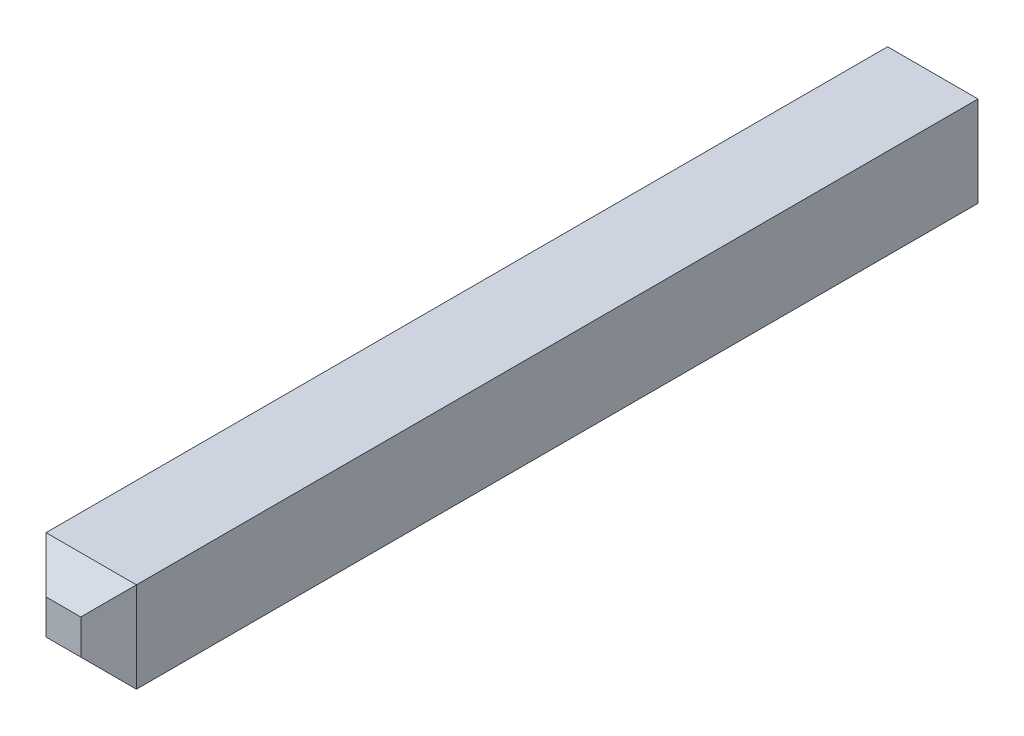
ISO-10303-21;
HEADER;
FILE_DESCRIPTION(('STEP AP214'),'2;1');
FILE_NAME('part.step','',(''),(''),'','','');
FILE_SCHEMA(('AUTOMOTIVE_DESIGN { 1 0 10303 214 1 1 1 1 }'));
ENDSEC;
DATA;
#1=APPLICATION_CONTEXT('core data for automotive mechanical design processes');
#2=APPLICATION_PROTOCOL_DEFINITION('international standard','automotive_design',2000,#1);
#3=PRODUCT_CONTEXT('',#1,'mechanical');
#4=PRODUCT('Part','Part','',(#3));
#5=PRODUCT_RELATED_PRODUCT_CATEGORY('part','',(#4));
#6=PRODUCT_DEFINITION_FORMATION('','',#4);
#7=PRODUCT_DEFINITION_CONTEXT('part definition',#1,'design');
#8=PRODUCT_DEFINITION('design','',#6,#7);
#9=PRODUCT_DEFINITION_SHAPE('','',#8);
#10=(LENGTH_UNIT() NAMED_UNIT(*) SI_UNIT(.MILLI.,.METRE.));
#11=(NAMED_UNIT(*) PLANE_ANGLE_UNIT() SI_UNIT($,.RADIAN.));
#12=(NAMED_UNIT(*) SI_UNIT($,.STERADIAN.) SOLID_ANGLE_UNIT());
#13=UNCERTAINTY_MEASURE_WITH_UNIT(LENGTH_MEASURE(1.E-05),#10,'distance_accuracy_value','');
#14=(GEOMETRIC_REPRESENTATION_CONTEXT(3) GLOBAL_UNCERTAINTY_ASSIGNED_CONTEXT((#13)) GLOBAL_UNIT_ASSIGNED_CONTEXT((#10,
#11,#12)) REPRESENTATION_CONTEXT('',''));
#15=CARTESIAN_POINT('',(0.,0.,0.));
#16=DIRECTION('',(0.,0.,1.));
#17=DIRECTION('',(1.,0.,0.));
#18=AXIS2_PLACEMENT_3D('',#15,#16,#17);
#19=CARTESIAN_POINT('',(-3.53369252079275,-15.8034131603604,27.6803044686323));
#20=DIRECTION('',(0.,-0.707106781186552,0.707106781186543));
#21=DIRECTION('',(-1.,0.,0.));
#22=AXIS2_PLACEMENT_3D('',#19,#20,#21);
#23=PLANE('',#22);
#24=DIRECTION('',(0.577350226437834,0.57735028136971,0.577350299761331));
#25=VECTOR('',#24,1.);
#26=CARTESIAN_POINT('',(-4.18759250839274,-15.8034131564397,27.6803044686323));
#27=LINE('',#26,#25);
#28=CARTESIAN_POINT('',(-4.18759250893674,-15.8034131589441,27.6803044690684));
#29=VERTEX_POINT('',#28);
#30=CARTESIAN_POINT('',(-3.98759252702116,-15.6034131561045,27.8803044747259));
#31=VERTEX_POINT('',#30);
#32=EDGE_CURVE('E28',#29,#31,#27,.T.);
#33=ORIENTED_EDGE('',*,*,#32,.F.);
#34=DIRECTION('',(1.,0.,0.));
#35=VECTOR('',#34,1.);
#36=CARTESIAN_POINT('',(-3.53759251299275,-15.8034131603604,27.6803044686323));
#37=LINE('',#36,#35);
#38=CARTESIAN_POINT('',(-3.53759251299275,-15.8034131588901,27.6803044696124));
#39=VERTEX_POINT('',#38);
#40=EDGE_CURVE('E11',#29,#39,#37,.T.);
#41=ORIENTED_EDGE('',*,*,#40,.T.);
#42=DIRECTION('',(0.577350275320162,-0.577350256928548,-0.577350275320168));
#43=VECTOR('',#42,1.);
#44=CARTESIAN_POINT('',(-3.73759251939275,-15.6034131564108,27.8803044750322));
#45=LINE('',#44,#43);
#46=CARTESIAN_POINT('',(-3.73759251957854,-15.6034131556124,27.8803044746054));
#47=VERTEX_POINT('',#46);
#48=EDGE_CURVE('E149',#47,#39,#45,.T.);
#49=ORIENTED_EDGE('',*,*,#48,.F.);
#50=DIRECTION('',(1.,0.,0.));
#51=VECTOR('',#50,1.);
#52=CARTESIAN_POINT('',(-3.98759252739274,-15.6034131564108,27.8803044750322));
#53=LINE('',#52,#51);
#54=EDGE_CURVE('E110',#31,#47,#53,.T.);
#55=ORIENTED_EDGE('',*,*,#54,.F.);
#56=EDGE_LOOP('',(#33,#41,#49,#55));
#57=FACE_BOUND('',#56,.T.);
#58=ADVANCED_FACE('F17',(#57),#23,.T.);
#59=CARTESIAN_POINT('',(-3.53759251299275,-15.8034131603604,27.6803044686323));
#60=DIRECTION('',(0.,1.,0.));
#61=DIRECTION('',(1.,0.,0.));
#62=AXIS2_PLACEMENT_3D('',#59,#60,#61);
#63=PLANE('',#62);
#64=DIRECTION('',(0.,0.,-1.));
#65=VECTOR('',#64,1.);
#66=CARTESIAN_POINT('',(-4.18759250839274,-15.8034131564397,27.6803044686323));
#67=LINE('',#66,#65);
#68=CARTESIAN_POINT('',(-4.18759250839274,-15.8034131584001,21.6303044782322));
#69=VERTEX_POINT('',#68);
#70=EDGE_CURVE('E101',#29,#69,#67,.T.);
#71=ORIENTED_EDGE('',*,*,#70,.T.);
#72=DIRECTION('',(1.,0.,0.));
#73=VECTOR('',#72,1.);
#74=CARTESIAN_POINT('',(-4.18759250839274,-15.8034131603604,21.6303044782322));
#75=LINE('',#74,#73);
#76=CARTESIAN_POINT('',(-3.53759251299275,-15.8034131603604,21.6303044782322));
#77=VERTEX_POINT('',#76);
#78=EDGE_CURVE('E127',#69,#77,#75,.T.);
#79=ORIENTED_EDGE('',*,*,#78,.T.);
#80=DIRECTION('',(0.,0.,1.));
#81=VECTOR('',#80,1.);
#82=CARTESIAN_POINT('',(-3.53759251299275,-15.8034131603604,21.6303044782322));
#83=LINE('',#82,#81);
#84=EDGE_CURVE('E109',#77,#39,#83,.T.);
#85=ORIENTED_EDGE('',*,*,#84,.T.);
#86=ORIENTED_EDGE('',*,*,#40,.F.);
#87=EDGE_LOOP('',(#71,#79,#85,#86));
#88=FACE_BOUND('',#87,.T.);
#89=ADVANCED_FACE('F107',(#88),#63,.F.);
#90=CARTESIAN_POINT('',(-4.18759250839274,-15.8073131525604,27.6803044686323));
#91=DIRECTION('',(-0.707106826087834,0.,0.707106736285258));
#92=DIRECTION('',(0.,1.,0.));
#93=AXIS2_PLACEMENT_3D('',#90,#91,#92);
#94=PLANE('',#93);
#95=DIRECTION('',(0.577350239918571,-0.577350283825147,0.577350283825157));
#96=VECTOR('',#95,1.);
#97=CARTESIAN_POINT('',(-4.18759251709672,-15.1534131649604,27.6803044686322));
#98=LINE('',#97,#96);
#99=CARTESIAN_POINT('',(-4.18759251274474,-15.1534131649604,27.6803044664563));
#100=VERTEX_POINT('',#99);
#101=CARTESIAN_POINT('',(-3.98759252664958,-15.3534131709888,27.8803044750322));
#102=VERTEX_POINT('',#101);
#103=EDGE_CURVE('E115',#100,#102,#98,.T.);
#104=ORIENTED_EDGE('',*,*,#103,.F.);
#105=DIRECTION('',(0.,-1.,0.));
#106=VECTOR('',#105,1.);
#107=CARTESIAN_POINT('',(-4.18759250839274,-15.8034131603604,27.6803044686323));
#108=LINE('',#107,#106);
#109=EDGE_CURVE('E59',#100,#29,#108,.T.);
#110=ORIENTED_EDGE('',*,*,#109,.T.);
#111=ORIENTED_EDGE('',*,*,#32,.T.);
#112=DIRECTION('',(0.,-1.,0.));
#113=VECTOR('',#112,1.);
#114=CARTESIAN_POINT('',(-3.98759252590642,-15.6034131539604,27.8803044750322));
#115=LINE('',#114,#113);
#116=EDGE_CURVE('E152',#102,#31,#115,.T.);
#117=ORIENTED_EDGE('',*,*,#116,.F.);
#118=EDGE_LOOP('',(#104,#110,#111,#117));
#119=FACE_BOUND('',#118,.T.);
#120=ADVANCED_FACE('F19',(#119),#94,.T.);
#121=CARTESIAN_POINT('',(-3.98759252739274,-15.6034131539604,27.8803044750322));
#122=DIRECTION('',(0.,0.,1.));
#123=DIRECTION('',(1.,0.,0.));
#124=AXIS2_PLACEMENT_3D('',#121,#122,#123);
#125=PLANE('',#124);
#126=ORIENTED_EDGE('',*,*,#116,.T.);
#127=ORIENTED_EDGE('',*,*,#54,.T.);
#128=DIRECTION('',(0.,-1.,0.));
#129=VECTOR('',#128,1.);
#130=CARTESIAN_POINT('',(-3.73759252013591,-15.8073131525604,27.8803044757754));
#131=LINE('',#130,#129);
#132=CARTESIAN_POINT('',(-3.73759251995012,-15.3534131713604,27.880304475218));
#133=VERTEX_POINT('',#132);
#134=EDGE_CURVE('E118',#133,#47,#131,.T.);
#135=ORIENTED_EDGE('',*,*,#134,.F.);
#136=DIRECTION('',(1.,0.,0.));
#137=VECTOR('',#136,1.);
#138=CARTESIAN_POINT('',(-3.53369252079275,-15.3534131713604,27.8803044750322));
#139=LINE('',#138,#137);
#140=EDGE_CURVE('E137',#102,#133,#139,.T.);
#141=ORIENTED_EDGE('',*,*,#140,.F.);
#142=EDGE_LOOP('',(#126,#127,#135,#141));
#143=FACE_BOUND('',#142,.T.);
#144=ADVANCED_FACE('F210',(#143),#125,.T.);
#145=CARTESIAN_POINT('',(-3.73759251939275,-15.8073131525604,27.8803044750322));
#146=DIRECTION('',(0.707106781186551,0.,0.707106781186545));
#147=DIRECTION('',(0.,-1.,0.));
#148=AXIS2_PLACEMENT_3D('',#145,#146,#147);
#149=PLANE('',#148);
#150=DIRECTION('',(0.577350264359742,0.577350271604563,-0.577350271604573));
#151=VECTOR('',#150,1.);
#152=CARTESIAN_POINT('',(-3.73759252087908,-15.3534131713604,27.8803044750322));
#153=LINE('',#152,#151);
#154=CARTESIAN_POINT('',(-3.53759251349225,-15.1534131639614,27.6803044686323));
#155=VERTEX_POINT('',#154);
#156=EDGE_CURVE('E21',#133,#155,#153,.T.);
#157=ORIENTED_EDGE('',*,*,#156,.F.);
#158=ORIENTED_EDGE('',*,*,#134,.T.);
#159=ORIENTED_EDGE('',*,*,#48,.T.);
#160=DIRECTION('',(0.,1.,0.));
#161=VECTOR('',#160,1.);
#162=CARTESIAN_POINT('',(-3.53759251299275,-15.8034131603604,27.6803044686323));
#163=LINE('',#162,#161);
#164=EDGE_CURVE('E132',#39,#155,#163,.T.);
#165=ORIENTED_EDGE('',*,*,#164,.T.);
#166=EDGE_LOOP('',(#157,#158,#159,#165));
#167=FACE_BOUND('',#166,.T.);
#168=ADVANCED_FACE('F214',(#167),#149,.T.);
#169=CARTESIAN_POINT('',(-4.18759250839274,-15.8034131603604,27.6803044686323));
#170=DIRECTION('',(1.,0.,0.));
#171=DIRECTION('',(0.,1.,0.));
#172=AXIS2_PLACEMENT_3D('',#169,#170,#171);
#173=PLANE('',#172);
#174=DIRECTION('',(0.,0.,-1.));
#175=VECTOR('',#174,1.);
#176=CARTESIAN_POINT('',(-4.18759251709672,-15.1534131649604,21.6303044782322));
#177=LINE('',#176,#175);
#178=CARTESIAN_POINT('',(-4.18759251056874,-15.1534131649604,21.6303044782322));
#179=VERTEX_POINT('',#178);
#180=EDGE_CURVE('E165',#100,#179,#177,.T.);
#181=ORIENTED_EDGE('',*,*,#180,.T.);
#182=DIRECTION('',(0.,-1.,0.));
#183=VECTOR('',#182,1.);
#184=CARTESIAN_POINT('',(-4.18759250839274,-15.8034131603604,21.6303044782322));
#185=LINE('',#184,#183);
#186=EDGE_CURVE('E76',#179,#69,#185,.T.);
#187=ORIENTED_EDGE('',*,*,#186,.T.);
#188=ORIENTED_EDGE('',*,*,#70,.F.);
#189=ORIENTED_EDGE('',*,*,#109,.F.);
#190=EDGE_LOOP('',(#181,#187,#188,#189));
#191=FACE_BOUND('',#190,.T.);
#192=ADVANCED_FACE('F119',(#191),#173,.F.);
#193=CARTESIAN_POINT('',(-4.18759250839274,-15.8034131603604,21.6303044782322));
#194=DIRECTION('',(0.,0.,1.));
#195=DIRECTION('',(1.,0.,0.));
#196=AXIS2_PLACEMENT_3D('',#193,#194,#195);
#197=PLANE('',#196);
#198=ORIENTED_EDGE('',*,*,#78,.F.);
#199=ORIENTED_EDGE('',*,*,#186,.F.);
#200=DIRECTION('',(1.,0.,0.));
#201=VECTOR('',#200,1.);
#202=CARTESIAN_POINT('',(-3.53759251299275,-15.1534131649604,21.6303044782322));
#203=LINE('',#202,#201);
#204=CARTESIAN_POINT('',(-3.53759251299275,-15.1534131649604,21.6303044782322));
#205=VERTEX_POINT('',#204);
#206=EDGE_CURVE('E158',#179,#205,#203,.T.);
#207=ORIENTED_EDGE('',*,*,#206,.T.);
#208=DIRECTION('',(0.,-1.,0.));
#209=VECTOR('',#208,1.);
#210=CARTESIAN_POINT('',(-3.53759251299275,-15.8034131603604,21.6303044782322));
#211=LINE('',#210,#209);
#212=EDGE_CURVE('E134',#205,#77,#211,.T.);
#213=ORIENTED_EDGE('',*,*,#212,.T.);
#214=EDGE_LOOP('',(#198,#199,#207,#213));
#215=FACE_BOUND('',#214,.T.);
#216=ADVANCED_FACE('F216',(#215),#197,.F.);
#217=CARTESIAN_POINT('',(-3.53759251299275,-15.8034131603604,21.6303044782322));
#218=DIRECTION('',(-1.,0.,0.));
#219=DIRECTION('',(0.,0.,1.));
#220=AXIS2_PLACEMENT_3D('',#217,#218,#219);
#221=PLANE('',#220);
#222=ORIENTED_EDGE('',*,*,#84,.F.);
#223=ORIENTED_EDGE('',*,*,#212,.F.);
#224=DIRECTION('',(0.,0.,1.));
#225=VECTOR('',#224,1.);
#226=CARTESIAN_POINT('',(-3.53759251299275,-15.1534131649604,21.6303044782322));
#227=LINE('',#226,#225);
#228=EDGE_CURVE('E155',#205,#155,#227,.T.);
#229=ORIENTED_EDGE('',*,*,#228,.T.);
#230=ORIENTED_EDGE('',*,*,#164,.F.);
#231=EDGE_LOOP('',(#222,#223,#229,#230));
#232=FACE_BOUND('',#231,.T.);
#233=ADVANCED_FACE('F198',(#232),#221,.F.);
#234=CARTESIAN_POINT('',(-3.53369252079275,-15.3534131713604,27.8803044750322));
#235=DIRECTION('',(0.,0.707106781186551,0.707106781186544));
#236=DIRECTION('',(1.,0.,0.));
#237=AXIS2_PLACEMENT_3D('',#234,#235,#236);
#238=PLANE('',#237);
#239=ORIENTED_EDGE('',*,*,#156,.T.);
#240=DIRECTION('',(-1.,0.,0.));
#241=VECTOR('',#240,1.);
#242=CARTESIAN_POINT('',(-3.53759251299275,-15.1534131649604,27.6803044686323));
#243=LINE('',#242,#241);
#244=EDGE_CURVE('E173',#155,#100,#243,.T.);
#245=ORIENTED_EDGE('',*,*,#244,.T.);
#246=ORIENTED_EDGE('',*,*,#103,.T.);
#247=ORIENTED_EDGE('',*,*,#140,.T.);
#248=EDGE_LOOP('',(#239,#245,#246,#247));
#249=FACE_BOUND('',#248,.T.);
#250=ADVANCED_FACE('F187',(#249),#238,.T.);
#251=CARTESIAN_POINT('',(-3.53759251299275,-15.1534131649604,21.6303044782322));
#252=DIRECTION('',(0.,-1.,0.));
#253=DIRECTION('',(0.,0.,-1.));
#254=AXIS2_PLACEMENT_3D('',#251,#252,#253);
#255=PLANE('',#254);
#256=ORIENTED_EDGE('',*,*,#228,.F.);
#257=ORIENTED_EDGE('',*,*,#206,.F.);
#258=ORIENTED_EDGE('',*,*,#180,.F.);
#259=ORIENTED_EDGE('',*,*,#244,.F.);
#260=EDGE_LOOP('',(#256,#257,#258,#259));
#261=FACE_BOUND('',#260,.T.);
#262=ADVANCED_FACE('F191',(#261),#255,.F.);
#263=CLOSED_SHELL('',(#58,#89,#120,#144,#168,#192,#216,#233,#250,#262));
#264=MANIFOLD_SOLID_BREP('B1',#263);
#265=ADVANCED_BREP_SHAPE_REPRESENTATION('',(#18,#264),#14);
#266=SHAPE_DEFINITION_REPRESENTATION(#9,#265);
ENDSEC;
END-ISO-10303-21;
